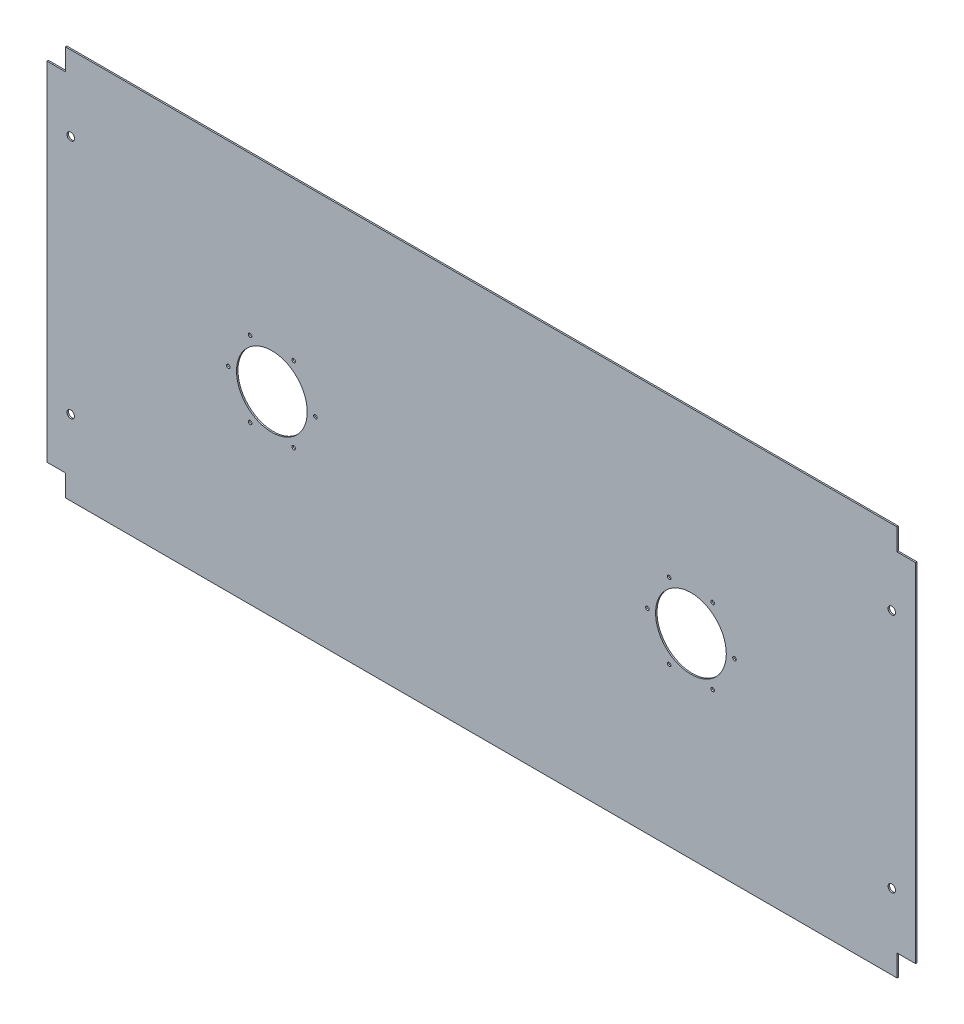
ISO-10303-21;
HEADER;
FILE_DESCRIPTION(('STEP AP214'),'2;1');
FILE_NAME('part.step','',(''),(''),'','','');
FILE_SCHEMA(('AUTOMOTIVE_DESIGN { 1 0 10303 214 1 1 1 1 }'));
ENDSEC;
DATA;
#1=APPLICATION_CONTEXT('core data for automotive mechanical design processes');
#2=APPLICATION_PROTOCOL_DEFINITION('international standard','automotive_design',2000,#1);
#3=PRODUCT_CONTEXT('',#1,'mechanical');
#4=PRODUCT('Part','Part','',(#3));
#5=PRODUCT_RELATED_PRODUCT_CATEGORY('part','',(#4));
#6=PRODUCT_DEFINITION_FORMATION('','',#4);
#7=PRODUCT_DEFINITION_CONTEXT('part definition',#1,'design');
#8=PRODUCT_DEFINITION('design','',#6,#7);
#9=PRODUCT_DEFINITION_SHAPE('','',#8);
#10=(LENGTH_UNIT() NAMED_UNIT(*) SI_UNIT(.MILLI.,.METRE.));
#11=(NAMED_UNIT(*) PLANE_ANGLE_UNIT() SI_UNIT($,.RADIAN.));
#12=(NAMED_UNIT(*) SI_UNIT($,.STERADIAN.) SOLID_ANGLE_UNIT());
#13=UNCERTAINTY_MEASURE_WITH_UNIT(LENGTH_MEASURE(1.E-05),#10,'distance_accuracy_value','');
#14=(GEOMETRIC_REPRESENTATION_CONTEXT(3) GLOBAL_UNCERTAINTY_ASSIGNED_CONTEXT((#13)) GLOBAL_UNIT_ASSIGNED_CONTEXT((#10,
#11,#12)) REPRESENTATION_CONTEXT('',''));
#15=CARTESIAN_POINT('',(0.,0.,0.));
#16=DIRECTION('',(0.,0.,1.));
#17=DIRECTION('',(1.,0.,0.));
#18=AXIS2_PLACEMENT_3D('',#15,#16,#17);
#19=CARTESIAN_POINT('',(438.9628,183.388,-100.838));
#20=DIRECTION('',(0.,-1.,0.));
#21=DIRECTION('',(0.,0.,-1.));
#22=AXIS2_PLACEMENT_3D('',#19,#20,#21);
#23=PLANE('',#22);
#24=DIRECTION('',(1.,0.,0.));
#25=VECTOR('',#24,1.);
#26=CARTESIAN_POINT('',(438.9628,183.388,0.));
#27=LINE('',#26,#25);
#28=CARTESIAN_POINT('',(438.9628,183.388,0.));
#29=VERTEX_POINT('',#28);
#30=CARTESIAN_POINT('',(458.583962531012,183.388,1.66533453693773E-13));
#31=VERTEX_POINT('',#30);
#32=EDGE_CURVE('E234',#29,#31,#27,.T.);
#33=ORIENTED_EDGE('',*,*,#32,.T.);
#34=DIRECTION('',(0.,0.,-1.));
#35=VECTOR('',#34,1.);
#36=CARTESIAN_POINT('',(458.583962531012,183.388,1.66533453693773E-13));
#37=LINE('',#36,#35);
#38=CARTESIAN_POINT('',(458.583962531012,183.388,-1.52399999999986));
#39=VERTEX_POINT('',#38);
#40=EDGE_CURVE('E265',#31,#39,#37,.T.);
#41=ORIENTED_EDGE('',*,*,#40,.T.);
#42=DIRECTION('',(1.,0.,0.));
#43=VECTOR('',#42,1.);
#44=CARTESIAN_POINT('',(0.,183.388,-1.524));
#45=LINE('',#44,#43);
#46=CARTESIAN_POINT('',(438.9628,183.388,-1.524));
#47=VERTEX_POINT('',#46);
#48=EDGE_CURVE('E151',#47,#39,#45,.T.);
#49=ORIENTED_EDGE('',*,*,#48,.F.);
#50=DIRECTION('',(0.,0.,1.));
#51=VECTOR('',#50,1.);
#52=CARTESIAN_POINT('',(438.9628,183.388,-100.838));
#53=LINE('',#52,#51);
#54=EDGE_CURVE('E328',#47,#29,#53,.T.);
#55=ORIENTED_EDGE('',*,*,#54,.T.);
#56=EDGE_LOOP('',(#33,#41,#49,#55));
#57=FACE_BOUND('',#56,.T.);
#58=ADVANCED_FACE('F135',(#57),#23,.F.);
#59=CARTESIAN_POINT('',(438.9628,189.738,-100.838));
#60=DIRECTION('',(-1.,0.,0.));
#61=DIRECTION('',(0.,0.,1.));
#62=AXIS2_PLACEMENT_3D('',#59,#60,#61);
#63=PLANE('',#62);
#64=DIRECTION('',(0.,-1.,0.));
#65=VECTOR('',#64,1.);
#66=CARTESIAN_POINT('',(438.9628,0.,-1.524));
#67=LINE('',#66,#65);
#68=CARTESIAN_POINT('',(438.9628,206.234962531012,-1.52399999999989));
#69=VERTEX_POINT('',#68);
#70=EDGE_CURVE('E243',#69,#47,#67,.T.);
#71=ORIENTED_EDGE('',*,*,#70,.F.);
#72=DIRECTION('',(0.,0.,1.));
#73=VECTOR('',#72,1.);
#74=CARTESIAN_POINT('',(438.9628,206.234962531012,1.11022302462516E-13));
#75=LINE('',#74,#73);
#76=CARTESIAN_POINT('',(438.9628,206.234962531012,0.));
#77=VERTEX_POINT('',#76);
#78=EDGE_CURVE('E240',#69,#77,#75,.T.);
#79=ORIENTED_EDGE('',*,*,#78,.T.);
#80=DIRECTION('',(0.,-1.,0.));
#81=VECTOR('',#80,1.);
#82=CARTESIAN_POINT('',(438.9628,189.738,0.));
#83=LINE('',#82,#81);
#84=EDGE_CURVE('E226',#77,#29,#83,.T.);
#85=ORIENTED_EDGE('',*,*,#84,.T.);
#86=ORIENTED_EDGE('',*,*,#54,.F.);
#87=EDGE_LOOP('',(#71,#79,#85,#86));
#88=FACE_BOUND('',#87,.T.);
#89=ADVANCED_FACE('F241',(#88),#63,.F.);
#90=CARTESIAN_POINT('',(-438.9628,183.388,-100.838));
#91=DIRECTION('',(0.,-1.,0.));
#92=DIRECTION('',(0.,0.,-1.));
#93=AXIS2_PLACEMENT_3D('',#90,#91,#92);
#94=PLANE('',#93);
#95=DIRECTION('',(1.,0.,0.));
#96=VECTOR('',#95,1.);
#97=CARTESIAN_POINT('',(0.,183.388,-1.524));
#98=LINE('',#97,#96);
#99=CARTESIAN_POINT('',(-458.583962531012,183.388,-1.52399999999986));
#100=VERTEX_POINT('',#99);
#101=CARTESIAN_POINT('',(-438.9628,183.388,-1.524));
#102=VERTEX_POINT('',#101);
#103=EDGE_CURVE('E419',#100,#102,#98,.T.);
#104=ORIENTED_EDGE('',*,*,#103,.F.);
#105=DIRECTION('',(0.,0.,1.));
#106=VECTOR('',#105,1.);
#107=CARTESIAN_POINT('',(-458.583962531012,183.388,1.66533453693773E-13));
#108=LINE('',#107,#106);
#109=CARTESIAN_POINT('',(-458.583962531012,183.388,1.11022302462516E-13));
#110=VERTEX_POINT('',#109);
#111=EDGE_CURVE('E275',#100,#110,#108,.T.);
#112=ORIENTED_EDGE('',*,*,#111,.T.);
#113=DIRECTION('',(1.,0.,0.));
#114=VECTOR('',#113,1.);
#115=CARTESIAN_POINT('',(-438.9628,183.388,0.));
#116=LINE('',#115,#114);
#117=CARTESIAN_POINT('',(-438.9628,183.388,0.));
#118=VERTEX_POINT('',#117);
#119=EDGE_CURVE('E320',#110,#118,#116,.T.);
#120=ORIENTED_EDGE('',*,*,#119,.T.);
#121=DIRECTION('',(0.,0.,1.));
#122=VECTOR('',#121,1.);
#123=CARTESIAN_POINT('',(-438.9628,183.388,-100.838));
#124=LINE('',#123,#122);
#125=EDGE_CURVE('E317',#102,#118,#124,.T.);
#126=ORIENTED_EDGE('',*,*,#125,.F.);
#127=EDGE_LOOP('',(#104,#112,#120,#126));
#128=FACE_BOUND('',#127,.T.);
#129=ADVANCED_FACE('F527',(#128),#94,.F.);
#130=CARTESIAN_POINT('',(-438.9628,189.738,-100.838));
#131=DIRECTION('',(1.,0.,0.));
#132=DIRECTION('',(0.,0.,-1.));
#133=AXIS2_PLACEMENT_3D('',#130,#131,#132);
#134=PLANE('',#133);
#135=DIRECTION('',(0.,1.,0.));
#136=VECTOR('',#135,1.);
#137=CARTESIAN_POINT('',(-438.9628,189.738,0.));
#138=LINE('',#137,#136);
#139=CARTESIAN_POINT('',(-438.9628,206.234962531012,0.));
#140=VERTEX_POINT('',#139);
#141=EDGE_CURVE('E325',#118,#140,#138,.T.);
#142=ORIENTED_EDGE('',*,*,#141,.T.);
#143=DIRECTION('',(0.,0.,-1.));
#144=VECTOR('',#143,1.);
#145=CARTESIAN_POINT('',(-438.9628,206.234962531012,1.11022302462516E-13));
#146=LINE('',#145,#144);
#147=CARTESIAN_POINT('',(-438.9628,206.234962531012,-1.52399999999989));
#148=VERTEX_POINT('',#147);
#149=EDGE_CURVE('E249',#140,#148,#146,.T.);
#150=ORIENTED_EDGE('',*,*,#149,.T.);
#151=DIRECTION('',(0.,1.,0.));
#152=VECTOR('',#151,1.);
#153=CARTESIAN_POINT('',(-438.9628,0.,-1.524));
#154=LINE('',#153,#152);
#155=EDGE_CURVE('E159',#102,#148,#154,.T.);
#156=ORIENTED_EDGE('',*,*,#155,.F.);
#157=ORIENTED_EDGE('',*,*,#125,.T.);
#158=EDGE_LOOP('',(#142,#150,#156,#157));
#159=FACE_BOUND('',#158,.T.);
#160=ADVANCED_FACE('F536',(#159),#134,.F.);
#161=CARTESIAN_POINT('',(-438.9628,-183.388,-100.838));
#162=DIRECTION('',(1.,0.,0.));
#163=DIRECTION('',(0.,0.,-1.));
#164=AXIS2_PLACEMENT_3D('',#161,#162,#163);
#165=PLANE('',#164);
#166=DIRECTION('',(0.,1.,0.));
#167=VECTOR('',#166,1.);
#168=CARTESIAN_POINT('',(-438.9628,0.,-1.524));
#169=LINE('',#168,#167);
#170=CARTESIAN_POINT('',(-438.9628,-206.234962531012,-1.52399999999991));
#171=VERTEX_POINT('',#170);
#172=CARTESIAN_POINT('',(-438.9628,-183.388,-1.524));
#173=VERTEX_POINT('',#172);
#174=EDGE_CURVE('E415',#171,#173,#169,.T.);
#175=ORIENTED_EDGE('',*,*,#174,.F.);
#176=DIRECTION('',(0.,0.,1.));
#177=VECTOR('',#176,1.);
#178=CARTESIAN_POINT('',(-438.9628,-206.234962531012,0.));
#179=LINE('',#178,#177);
#180=CARTESIAN_POINT('',(-438.9628,-206.234962531012,0.));
#181=VERTEX_POINT('',#180);
#182=EDGE_CURVE('E291',#171,#181,#179,.T.);
#183=ORIENTED_EDGE('',*,*,#182,.T.);
#184=DIRECTION('',(0.,1.,0.));
#185=VECTOR('',#184,1.);
#186=CARTESIAN_POINT('',(-438.9628,-183.388,0.));
#187=LINE('',#186,#185);
#188=CARTESIAN_POINT('',(-438.9628,-183.388,0.));
#189=VERTEX_POINT('',#188);
#190=EDGE_CURVE('E312',#181,#189,#187,.T.);
#191=ORIENTED_EDGE('',*,*,#190,.T.);
#192=DIRECTION('',(0.,0.,1.));
#193=VECTOR('',#192,1.);
#194=CARTESIAN_POINT('',(-438.9628,-183.388,-100.838));
#195=LINE('',#194,#193);
#196=EDGE_CURVE('E295',#173,#189,#195,.T.);
#197=ORIENTED_EDGE('',*,*,#196,.F.);
#198=EDGE_LOOP('',(#175,#183,#191,#197));
#199=FACE_BOUND('',#198,.T.);
#200=ADVANCED_FACE('F538',(#199),#165,.F.);
#201=CARTESIAN_POINT('',(-442.087,-183.388,-100.838));
#202=DIRECTION('',(0.,1.,0.));
#203=DIRECTION('',(0.,0.,1.));
#204=AXIS2_PLACEMENT_3D('',#201,#202,#203);
#205=PLANE('',#204);
#206=DIRECTION('',(-1.,0.,0.));
#207=VECTOR('',#206,1.);
#208=CARTESIAN_POINT('',(-442.087,-183.388,0.));
#209=LINE('',#208,#207);
#210=CARTESIAN_POINT('',(-458.583962531012,-183.388,1.11022302462516E-13));
#211=VERTEX_POINT('',#210);
#212=EDGE_CURVE('E309',#189,#211,#209,.T.);
#213=ORIENTED_EDGE('',*,*,#212,.T.);
#214=DIRECTION('',(0.,0.,-1.));
#215=VECTOR('',#214,1.);
#216=CARTESIAN_POINT('',(-458.583962531012,-183.388,1.66533453693773E-13));
#217=LINE('',#216,#215);
#218=CARTESIAN_POINT('',(-458.583962531012,-183.388,-1.52399999999986));
#219=VERTEX_POINT('',#218);
#220=EDGE_CURVE('E280',#211,#219,#217,.T.);
#221=ORIENTED_EDGE('',*,*,#220,.T.);
#222=DIRECTION('',(-1.,0.,0.));
#223=VECTOR('',#222,1.);
#224=CARTESIAN_POINT('',(0.,-183.388,-1.524));
#225=LINE('',#224,#223);
#226=EDGE_CURVE('E423',#173,#219,#225,.T.);
#227=ORIENTED_EDGE('',*,*,#226,.F.);
#228=ORIENTED_EDGE('',*,*,#196,.T.);
#229=EDGE_LOOP('',(#213,#221,#227,#228));
#230=FACE_BOUND('',#229,.T.);
#231=ADVANCED_FACE('F543',(#230),#205,.F.);
#232=CARTESIAN_POINT('',(438.9628,-183.388,-100.838));
#233=DIRECTION('',(-1.,0.,0.));
#234=DIRECTION('',(0.,0.,1.));
#235=AXIS2_PLACEMENT_3D('',#232,#233,#234);
#236=PLANE('',#235);
#237=DIRECTION('',(0.,-1.,0.));
#238=VECTOR('',#237,1.);
#239=CARTESIAN_POINT('',(438.9628,-183.388,0.));
#240=LINE('',#239,#238);
#241=CARTESIAN_POINT('',(438.9628,-183.388,0.));
#242=VERTEX_POINT('',#241);
#243=CARTESIAN_POINT('',(438.9628,-206.234962531012,0.));
#244=VERTEX_POINT('',#243);
#245=EDGE_CURVE('E321',#242,#244,#240,.T.);
#246=ORIENTED_EDGE('',*,*,#245,.T.);
#247=DIRECTION('',(0.,0.,-1.));
#248=VECTOR('',#247,1.);
#249=CARTESIAN_POINT('',(438.9628,-206.234962531012,0.));
#250=LINE('',#249,#248);
#251=CARTESIAN_POINT('',(438.9628,-206.234962531012,-1.52399999999991));
#252=VERTEX_POINT('',#251);
#253=EDGE_CURVE('E296',#244,#252,#250,.T.);
#254=ORIENTED_EDGE('',*,*,#253,.T.);
#255=DIRECTION('',(0.,-1.,0.));
#256=VECTOR('',#255,1.);
#257=CARTESIAN_POINT('',(438.9628,0.,-1.524));
#258=LINE('',#257,#256);
#259=CARTESIAN_POINT('',(438.9628,-183.388,-1.524));
#260=VERTEX_POINT('',#259);
#261=EDGE_CURVE('E412',#260,#252,#258,.T.);
#262=ORIENTED_EDGE('',*,*,#261,.F.);
#263=DIRECTION('',(0.,0.,1.));
#264=VECTOR('',#263,1.);
#265=CARTESIAN_POINT('',(438.9628,-183.388,-100.838));
#266=LINE('',#265,#264);
#267=EDGE_CURVE('E316',#260,#242,#266,.T.);
#268=ORIENTED_EDGE('',*,*,#267,.T.);
#269=EDGE_LOOP('',(#246,#254,#262,#268));
#270=FACE_BOUND('',#269,.T.);
#271=ADVANCED_FACE('F534',(#270),#236,.F.);
#272=CARTESIAN_POINT('',(438.9628,-183.388,-100.838));
#273=DIRECTION('',(0.,1.,0.));
#274=DIRECTION('',(0.,0.,1.));
#275=AXIS2_PLACEMENT_3D('',#272,#273,#274);
#276=PLANE('',#275);
#277=DIRECTION('',(-1.,0.,0.));
#278=VECTOR('',#277,1.);
#279=CARTESIAN_POINT('',(0.,-183.388,-1.524));
#280=LINE('',#279,#278);
#281=CARTESIAN_POINT('',(458.583962531012,-183.388,-1.52399999999986));
#282=VERTEX_POINT('',#281);
#283=EDGE_CURVE('E426',#282,#260,#280,.T.);
#284=ORIENTED_EDGE('',*,*,#283,.F.);
#285=DIRECTION('',(0.,0.,1.));
#286=VECTOR('',#285,1.);
#287=CARTESIAN_POINT('',(458.583962531012,-183.388,1.66533453693773E-13));
#288=LINE('',#287,#286);
#289=CARTESIAN_POINT('',(458.583962531012,-183.388,1.11022302462516E-13));
#290=VERTEX_POINT('',#289);
#291=EDGE_CURVE('E260',#282,#290,#288,.T.);
#292=ORIENTED_EDGE('',*,*,#291,.T.);
#293=DIRECTION('',(-1.,0.,0.));
#294=VECTOR('',#293,1.);
#295=CARTESIAN_POINT('',(438.9628,-183.388,0.));
#296=LINE('',#295,#294);
#297=EDGE_CURVE('E332',#290,#242,#296,.T.);
#298=ORIENTED_EDGE('',*,*,#297,.T.);
#299=ORIENTED_EDGE('',*,*,#267,.F.);
#300=EDGE_LOOP('',(#284,#292,#298,#299));
#301=FACE_BOUND('',#300,.T.);
#302=ADVANCED_FACE('F531',(#301),#276,.F.);
#303=CARTESIAN_POINT('',(0.,0.,-1.524));
#304=DIRECTION('',(0.,0.,1.));
#305=DIRECTION('',(1.,0.,0.));
#306=AXIS2_PLACEMENT_3D('',#303,#304,#305);
#307=PLANE('',#306);
#308=CARTESIAN_POINT('',(267.335,0.,-1.524));
#309=DIRECTION('',(0.,0.,1.));
#310=DIRECTION('',(1.,0.,0.));
#311=AXIS2_PLACEMENT_3D('',#308,#309,#310);
#312=CIRCLE('',#311,1.90499999999999);
#313=CARTESIAN_POINT('',(269.24,0.,-1.524));
#314=VERTEX_POINT('',#313);
#315=EDGE_CURVE('E13',#314,#314,#312,.T.);
#316=ORIENTED_EDGE('',*,*,#315,.T.);
#317=EDGE_LOOP('',(#316));
#318=FACE_BOUND('',#317,.T.);
#319=CARTESIAN_POINT('',(244.348,39.814651913586,-1.524));
#320=DIRECTION('',(0.,0.,1.));
#321=DIRECTION('',(1.,0.,0.));
#322=AXIS2_PLACEMENT_3D('',#319,#320,#321);
#323=CIRCLE('',#322,1.90499999999999);
#324=CARTESIAN_POINT('',(246.253,39.814651913586,-1.524));
#325=VERTEX_POINT('',#324);
#326=EDGE_CURVE('E144',#325,#325,#323,.T.);
#327=ORIENTED_EDGE('',*,*,#326,.T.);
#328=EDGE_LOOP('',(#327));
#329=FACE_BOUND('',#328,.T.);
#330=CARTESIAN_POINT('',(198.374,-39.814651913586,-1.524));
#331=DIRECTION('',(0.,0.,1.));
#332=DIRECTION('',(1.,0.,0.));
#333=AXIS2_PLACEMENT_3D('',#330,#331,#332);
#334=CIRCLE('',#333,1.90499999999999);
#335=CARTESIAN_POINT('',(200.279,-39.814651913586,-1.524));
#336=VERTEX_POINT('',#335);
#337=EDGE_CURVE('E496',#336,#336,#334,.T.);
#338=ORIENTED_EDGE('',*,*,#337,.T.);
#339=EDGE_LOOP('',(#338));
#340=FACE_BOUND('',#339,.T.);
#341=CARTESIAN_POINT('',(244.348,-39.8146519135856,-1.524));
#342=DIRECTION('',(0.,0.,1.));
#343=DIRECTION('',(1.,0.,0.));
#344=AXIS2_PLACEMENT_3D('',#341,#342,#343);
#345=CIRCLE('',#344,1.90499999999999);
#346=CARTESIAN_POINT('',(246.253,-39.8146519135856,-1.524));
#347=VERTEX_POINT('',#346);
#348=EDGE_CURVE('E492',#347,#347,#345,.T.);
#349=ORIENTED_EDGE('',*,*,#348,.T.);
#350=EDGE_LOOP('',(#349));
#351=FACE_BOUND('',#350,.T.);
#352=CARTESIAN_POINT('',(-433.451,-127.,-1.524));
#353=DIRECTION('',(0.,0.,1.));
#354=DIRECTION('',(1.,0.,0.));
#355=AXIS2_PLACEMENT_3D('',#352,#353,#354);
#356=CIRCLE('',#355,3.9624);
#357=CARTESIAN_POINT('',(-429.4886,-127.,-1.524));
#358=VERTEX_POINT('',#357);
#359=EDGE_CURVE('E488',#358,#358,#356,.T.);
#360=ORIENTED_EDGE('',*,*,#359,.T.);
#361=EDGE_LOOP('',(#360));
#362=FACE_BOUND('',#361,.T.);
#363=CARTESIAN_POINT('',(433.451,127.,-1.524));
#364=DIRECTION('',(0.,0.,1.));
#365=DIRECTION('',(1.,0.,0.));
#366=AXIS2_PLACEMENT_3D('',#363,#364,#365);
#367=CIRCLE('',#366,3.9624);
#368=CARTESIAN_POINT('',(437.4134,127.,-1.524));
#369=VERTEX_POINT('',#368);
#370=EDGE_CURVE('E484',#369,#369,#367,.T.);
#371=ORIENTED_EDGE('',*,*,#370,.T.);
#372=EDGE_LOOP('',(#371));
#373=FACE_BOUND('',#372,.T.);
#374=CARTESIAN_POINT('',(433.451,-127.,-1.524));
#375=DIRECTION('',(0.,0.,1.));
#376=DIRECTION('',(1.,0.,0.));
#377=AXIS2_PLACEMENT_3D('',#374,#375,#376);
#378=CIRCLE('',#377,3.9624);
#379=CARTESIAN_POINT('',(437.4134,-127.,-1.524));
#380=VERTEX_POINT('',#379);
#381=EDGE_CURVE('E480',#380,#380,#378,.T.);
#382=ORIENTED_EDGE('',*,*,#381,.T.);
#383=EDGE_LOOP('',(#382));
#384=FACE_BOUND('',#383,.T.);
#385=CARTESIAN_POINT('',(198.374,39.8146519135857,-1.524));
#386=DIRECTION('',(0.,0.,1.));
#387=DIRECTION('',(1.,0.,0.));
#388=AXIS2_PLACEMENT_3D('',#385,#386,#387);
#389=CIRCLE('',#388,1.90499999999999);
#390=CARTESIAN_POINT('',(200.279,39.8146519135857,-1.524));
#391=VERTEX_POINT('',#390);
#392=EDGE_CURVE('E476',#391,#391,#389,.T.);
#393=ORIENTED_EDGE('',*,*,#392,.T.);
#394=EDGE_LOOP('',(#393));
#395=FACE_BOUND('',#394,.T.);
#396=CARTESIAN_POINT('',(-198.12,39.814651913586,-1.524));
#397=DIRECTION('',(0.,0.,1.));
#398=DIRECTION('',(1.,0.,0.));
#399=AXIS2_PLACEMENT_3D('',#396,#397,#398);
#400=CIRCLE('',#399,1.90499999999999);
#401=CARTESIAN_POINT('',(-196.215,39.814651913586,-1.524));
#402=VERTEX_POINT('',#401);
#403=EDGE_CURVE('E472',#402,#402,#400,.T.);
#404=ORIENTED_EDGE('',*,*,#403,.T.);
#405=EDGE_LOOP('',(#404));
#406=FACE_BOUND('',#405,.T.);
#407=CARTESIAN_POINT('',(-175.133,0.,-1.524));
#408=DIRECTION('',(0.,0.,1.));
#409=DIRECTION('',(1.,0.,0.));
#410=AXIS2_PLACEMENT_3D('',#407,#408,#409);
#411=CIRCLE('',#410,1.90499999999999);
#412=CARTESIAN_POINT('',(-173.228,0.,-1.524));
#413=VERTEX_POINT('',#412);
#414=EDGE_CURVE('E468',#413,#413,#411,.T.);
#415=ORIENTED_EDGE('',*,*,#414,.T.);
#416=EDGE_LOOP('',(#415));
#417=FACE_BOUND('',#416,.T.);
#418=CARTESIAN_POINT('',(-267.081,0.,-1.524));
#419=DIRECTION('',(0.,0.,1.));
#420=DIRECTION('',(1.,0.,0.));
#421=AXIS2_PLACEMENT_3D('',#418,#419,#420);
#422=CIRCLE('',#421,1.90499999999999);
#423=CARTESIAN_POINT('',(-265.176,0.,-1.524));
#424=VERTEX_POINT('',#423);
#425=EDGE_CURVE('E464',#424,#424,#422,.T.);
#426=ORIENTED_EDGE('',*,*,#425,.T.);
#427=EDGE_LOOP('',(#426));
#428=FACE_BOUND('',#427,.T.);
#429=CARTESIAN_POINT('',(221.361,0.,-1.524));
#430=DIRECTION('',(0.,0.,1.));
#431=DIRECTION('',(1.,0.,0.));
#432=AXIS2_PLACEMENT_3D('',#429,#430,#431);
#433=CIRCLE('',#432,37.338);
#434=CARTESIAN_POINT('',(258.699,0.,-1.524));
#435=VERTEX_POINT('',#434);
#436=EDGE_CURVE('E460',#435,#435,#433,.T.);
#437=ORIENTED_EDGE('',*,*,#436,.T.);
#438=EDGE_LOOP('',(#437));
#439=FACE_BOUND('',#438,.T.);
#440=CARTESIAN_POINT('',(-244.094,39.8146519135857,-1.524));
#441=DIRECTION('',(0.,0.,1.));
#442=DIRECTION('',(1.,0.,0.));
#443=AXIS2_PLACEMENT_3D('',#440,#441,#442);
#444=CIRCLE('',#443,1.90499999999999);
#445=CARTESIAN_POINT('',(-242.189,39.8146519135857,-1.524));
#446=VERTEX_POINT('',#445);
#447=EDGE_CURVE('E456',#446,#446,#444,.T.);
#448=ORIENTED_EDGE('',*,*,#447,.T.);
#449=EDGE_LOOP('',(#448));
#450=FACE_BOUND('',#449,.T.);
#451=CARTESIAN_POINT('',(-244.094,-39.814651913586,-1.524));
#452=DIRECTION('',(0.,0.,1.));
#453=DIRECTION('',(1.,0.,0.));
#454=AXIS2_PLACEMENT_3D('',#451,#452,#453);
#455=CIRCLE('',#454,1.90499999999999);
#456=CARTESIAN_POINT('',(-242.189,-39.814651913586,-1.524));
#457=VERTEX_POINT('',#456);
#458=EDGE_CURVE('E452',#457,#457,#455,.T.);
#459=ORIENTED_EDGE('',*,*,#458,.T.);
#460=EDGE_LOOP('',(#459));
#461=FACE_BOUND('',#460,.T.);
#462=CARTESIAN_POINT('',(-198.12,-39.8146519135857,-1.524));
#463=DIRECTION('',(0.,0.,1.));
#464=DIRECTION('',(1.,0.,0.));
#465=AXIS2_PLACEMENT_3D('',#462,#463,#464);
#466=CIRCLE('',#465,1.90499999999999);
#467=CARTESIAN_POINT('',(-196.215,-39.8146519135857,-1.524));
#468=VERTEX_POINT('',#467);
#469=EDGE_CURVE('E448',#468,#468,#466,.T.);
#470=ORIENTED_EDGE('',*,*,#469,.T.);
#471=EDGE_LOOP('',(#470));
#472=FACE_BOUND('',#471,.T.);
#473=CARTESIAN_POINT('',(175.387,0.,-1.524));
#474=DIRECTION('',(0.,0.,1.));
#475=DIRECTION('',(1.,0.,0.));
#476=AXIS2_PLACEMENT_3D('',#473,#474,#475);
#477=CIRCLE('',#476,1.90499999999999);
#478=CARTESIAN_POINT('',(177.292,0.,-1.524));
#479=VERTEX_POINT('',#478);
#480=EDGE_CURVE('E444',#479,#479,#477,.T.);
#481=ORIENTED_EDGE('',*,*,#480,.T.);
#482=EDGE_LOOP('',(#481));
#483=FACE_BOUND('',#482,.T.);
#484=CARTESIAN_POINT('',(-433.451,127.,-1.524));
#485=DIRECTION('',(0.,0.,1.));
#486=DIRECTION('',(1.,0.,0.));
#487=AXIS2_PLACEMENT_3D('',#484,#485,#486);
#488=CIRCLE('',#487,3.9624);
#489=CARTESIAN_POINT('',(-429.4886,127.,-1.524));
#490=VERTEX_POINT('',#489);
#491=EDGE_CURVE('E440',#490,#490,#488,.T.);
#492=ORIENTED_EDGE('',*,*,#491,.T.);
#493=EDGE_LOOP('',(#492));
#494=FACE_BOUND('',#493,.T.);
#495=CARTESIAN_POINT('',(-221.107,0.,-1.524));
#496=DIRECTION('',(0.,0.,1.));
#497=DIRECTION('',(1.,0.,0.));
#498=AXIS2_PLACEMENT_3D('',#495,#496,#497);
#499=CIRCLE('',#498,37.338);
#500=CARTESIAN_POINT('',(-183.769,0.,-1.524));
#501=VERTEX_POINT('',#500);
#502=EDGE_CURVE('E436',#501,#501,#499,.T.);
#503=ORIENTED_EDGE('',*,*,#502,.T.);
#504=EDGE_LOOP('',(#503));
#505=FACE_BOUND('',#504,.T.);
#506=ORIENTED_EDGE('',*,*,#174,.T.);
#507=ORIENTED_EDGE('',*,*,#226,.T.);
#508=DIRECTION('',(0.,1.,0.));
#509=VECTOR('',#508,1.);
#510=CARTESIAN_POINT('',(-458.583962531012,0.,-1.52399999999986));
#511=LINE('',#510,#509);
#512=EDGE_CURVE('E284',#219,#100,#511,.T.);
#513=ORIENTED_EDGE('',*,*,#512,.T.);
#514=ORIENTED_EDGE('',*,*,#103,.T.);
#515=ORIENTED_EDGE('',*,*,#155,.T.);
#516=DIRECTION('',(-1.,0.,0.));
#517=VECTOR('',#516,1.);
#518=CARTESIAN_POINT('',(0.,206.234962531012,-1.52399999999989));
#519=LINE('',#518,#517);
#520=EDGE_CURVE('E254',#148,#69,#519,.F.);
#521=ORIENTED_EDGE('',*,*,#520,.T.);
#522=ORIENTED_EDGE('',*,*,#70,.T.);
#523=ORIENTED_EDGE('',*,*,#48,.T.);
#524=DIRECTION('',(0.,-1.,0.));
#525=VECTOR('',#524,1.);
#526=CARTESIAN_POINT('',(458.583962531012,0.,-1.52399999999986));
#527=LINE('',#526,#525);
#528=EDGE_CURVE('E268',#39,#282,#527,.T.);
#529=ORIENTED_EDGE('',*,*,#528,.T.);
#530=ORIENTED_EDGE('',*,*,#283,.T.);
#531=ORIENTED_EDGE('',*,*,#261,.T.);
#532=DIRECTION('',(-1.,0.,0.));
#533=VECTOR('',#532,1.);
#534=CARTESIAN_POINT('',(0.,-206.234962531012,-1.52399999999991));
#535=LINE('',#534,#533);
#536=EDGE_CURVE('E300',#252,#171,#535,.T.);
#537=ORIENTED_EDGE('',*,*,#536,.T.);
#538=EDGE_LOOP('',(#506,#507,#513,#514,#515,#521,#522,#523,#529,#530,#531,#537));
#539=FACE_BOUND('',#538,.T.);
#540=ADVANCED_FACE('F503',(#318,#329,#340,#351,#362,#373,#384,#395,#406,#417,#428,#439,#450,
#461,#472,#483,#494,#505,#539),#307,.F.);
#541=CARTESIAN_POINT('',(0.,0.,0.));
#542=DIRECTION('',(0.,0.,1.));
#543=DIRECTION('',(1.,0.,0.));
#544=AXIS2_PLACEMENT_3D('',#541,#542,#543);
#545=PLANE('',#544);
#546=CARTESIAN_POINT('',(267.335,0.,0.));
#547=DIRECTION('',(0.,0.,1.));
#548=DIRECTION('',(1.,0.,0.));
#549=AXIS2_PLACEMENT_3D('',#546,#547,#548);
#550=CIRCLE('',#549,1.90499999999999);
#551=CARTESIAN_POINT('',(269.24,0.,0.));
#552=VERTEX_POINT('',#551);
#553=EDGE_CURVE('E361',#552,#552,#550,.T.);
#554=ORIENTED_EDGE('',*,*,#553,.F.);
#555=EDGE_LOOP('',(#554));
#556=FACE_BOUND('',#555,.T.);
#557=CARTESIAN_POINT('',(244.348,39.814651913586,0.));
#558=DIRECTION('',(0.,0.,1.));
#559=DIRECTION('',(1.,0.,0.));
#560=AXIS2_PLACEMENT_3D('',#557,#558,#559);
#561=CIRCLE('',#560,1.90499999999999);
#562=CARTESIAN_POINT('',(246.253,39.814651913586,0.));
#563=VERTEX_POINT('',#562);
#564=EDGE_CURVE('E366',#563,#563,#561,.T.);
#565=ORIENTED_EDGE('',*,*,#564,.F.);
#566=EDGE_LOOP('',(#565));
#567=FACE_BOUND('',#566,.T.);
#568=CARTESIAN_POINT('',(198.374,-39.814651913586,0.));
#569=DIRECTION('',(0.,0.,1.));
#570=DIRECTION('',(1.,0.,0.));
#571=AXIS2_PLACEMENT_3D('',#568,#569,#570);
#572=CIRCLE('',#571,1.90499999999999);
#573=CARTESIAN_POINT('',(200.279,-39.814651913586,0.));
#574=VERTEX_POINT('',#573);
#575=EDGE_CURVE('E370',#574,#574,#572,.T.);
#576=ORIENTED_EDGE('',*,*,#575,.F.);
#577=EDGE_LOOP('',(#576));
#578=FACE_BOUND('',#577,.T.);
#579=CARTESIAN_POINT('',(244.348,-39.8146519135856,0.));
#580=DIRECTION('',(0.,0.,1.));
#581=DIRECTION('',(1.,0.,0.));
#582=AXIS2_PLACEMENT_3D('',#579,#580,#581);
#583=CIRCLE('',#582,1.90499999999999);
#584=CARTESIAN_POINT('',(246.253,-39.8146519135856,0.));
#585=VERTEX_POINT('',#584);
#586=EDGE_CURVE('E357',#585,#585,#583,.T.);
#587=ORIENTED_EDGE('',*,*,#586,.F.);
#588=EDGE_LOOP('',(#587));
#589=FACE_BOUND('',#588,.T.);
#590=CARTESIAN_POINT('',(-433.451,-127.,0.));
#591=DIRECTION('',(0.,0.,1.));
#592=DIRECTION('',(1.,0.,0.));
#593=AXIS2_PLACEMENT_3D('',#590,#591,#592);
#594=CIRCLE('',#593,3.9624);
#595=CARTESIAN_POINT('',(-429.4886,-127.,0.));
#596=VERTEX_POINT('',#595);
#597=EDGE_CURVE('E340',#596,#596,#594,.T.);
#598=ORIENTED_EDGE('',*,*,#597,.F.);
#599=EDGE_LOOP('',(#598));
#600=FACE_BOUND('',#599,.T.);
#601=CARTESIAN_POINT('',(433.451,127.,0.));
#602=DIRECTION('',(0.,0.,1.));
#603=DIRECTION('',(1.,0.,0.));
#604=AXIS2_PLACEMENT_3D('',#601,#602,#603);
#605=CIRCLE('',#604,3.9624);
#606=CARTESIAN_POINT('',(437.4134,127.,0.));
#607=VERTEX_POINT('',#606);
#608=EDGE_CURVE('E345',#607,#607,#605,.T.);
#609=ORIENTED_EDGE('',*,*,#608,.F.);
#610=EDGE_LOOP('',(#609));
#611=FACE_BOUND('',#610,.T.);
#612=CARTESIAN_POINT('',(433.451,-127.,0.));
#613=DIRECTION('',(0.,0.,1.));
#614=DIRECTION('',(1.,0.,0.));
#615=AXIS2_PLACEMENT_3D('',#612,#613,#614);
#616=CIRCLE('',#615,3.9624);
#617=CARTESIAN_POINT('',(437.4134,-127.,0.));
#618=VERTEX_POINT('',#617);
#619=EDGE_CURVE('E349',#618,#618,#616,.T.);
#620=ORIENTED_EDGE('',*,*,#619,.F.);
#621=EDGE_LOOP('',(#620));
#622=FACE_BOUND('',#621,.T.);
#623=CARTESIAN_POINT('',(198.374,39.8146519135857,0.));
#624=DIRECTION('',(0.,0.,1.));
#625=DIRECTION('',(1.,0.,0.));
#626=AXIS2_PLACEMENT_3D('',#623,#624,#625);
#627=CIRCLE('',#626,1.90499999999999);
#628=CARTESIAN_POINT('',(200.279,39.8146519135857,0.));
#629=VERTEX_POINT('',#628);
#630=EDGE_CURVE('E353',#629,#629,#627,.T.);
#631=ORIENTED_EDGE('',*,*,#630,.F.);
#632=EDGE_LOOP('',(#631));
#633=FACE_BOUND('',#632,.T.);
#634=CARTESIAN_POINT('',(-198.12,39.814651913586,0.));
#635=DIRECTION('',(0.,0.,1.));
#636=DIRECTION('',(1.,0.,0.));
#637=AXIS2_PLACEMENT_3D('',#634,#635,#636);
#638=CIRCLE('',#637,1.90499999999999);
#639=CARTESIAN_POINT('',(-196.215,39.814651913586,0.));
#640=VERTEX_POINT('',#639);
#641=EDGE_CURVE('E381',#640,#640,#638,.T.);
#642=ORIENTED_EDGE('',*,*,#641,.F.);
#643=EDGE_LOOP('',(#642));
#644=FACE_BOUND('',#643,.T.);
#645=CARTESIAN_POINT('',(-175.133,0.,0.));
#646=DIRECTION('',(0.,0.,1.));
#647=DIRECTION('',(1.,0.,0.));
#648=AXIS2_PLACEMENT_3D('',#645,#646,#647);
#649=CIRCLE('',#648,1.90499999999999);
#650=CARTESIAN_POINT('',(-173.228,0.,0.));
#651=VERTEX_POINT('',#650);
#652=EDGE_CURVE('E393',#651,#651,#649,.T.);
#653=ORIENTED_EDGE('',*,*,#652,.F.);
#654=EDGE_LOOP('',(#653));
#655=FACE_BOUND('',#654,.T.);
#656=CARTESIAN_POINT('',(-267.081,0.,0.));
#657=DIRECTION('',(0.,0.,1.));
#658=DIRECTION('',(1.,0.,0.));
#659=AXIS2_PLACEMENT_3D('',#656,#657,#658);
#660=CIRCLE('',#659,1.90499999999999);
#661=CARTESIAN_POINT('',(-265.176,0.,0.));
#662=VERTEX_POINT('',#661);
#663=EDGE_CURVE('E397',#662,#662,#660,.T.);
#664=ORIENTED_EDGE('',*,*,#663,.F.);
#665=EDGE_LOOP('',(#664));
#666=FACE_BOUND('',#665,.T.);
#667=CARTESIAN_POINT('',(221.361,0.,0.));
#668=DIRECTION('',(0.,0.,1.));
#669=DIRECTION('',(1.,0.,0.));
#670=AXIS2_PLACEMENT_3D('',#667,#668,#669);
#671=CIRCLE('',#670,37.338);
#672=CARTESIAN_POINT('',(258.699,0.,0.));
#673=VERTEX_POINT('',#672);
#674=EDGE_CURVE('E401',#673,#673,#671,.T.);
#675=ORIENTED_EDGE('',*,*,#674,.F.);
#676=EDGE_LOOP('',(#675));
#677=FACE_BOUND('',#676,.T.);
#678=CARTESIAN_POINT('',(-244.094,39.8146519135857,0.));
#679=DIRECTION('',(0.,0.,1.));
#680=DIRECTION('',(1.,0.,0.));
#681=AXIS2_PLACEMENT_3D('',#678,#679,#680);
#682=CIRCLE('',#681,1.90499999999999);
#683=CARTESIAN_POINT('',(-242.189,39.8146519135857,0.));
#684=VERTEX_POINT('',#683);
#685=EDGE_CURVE('E377',#684,#684,#682,.T.);
#686=ORIENTED_EDGE('',*,*,#685,.F.);
#687=EDGE_LOOP('',(#686));
#688=FACE_BOUND('',#687,.T.);
#689=CARTESIAN_POINT('',(-244.094,-39.814651913586,0.));
#690=DIRECTION('',(0.,0.,1.));
#691=DIRECTION('',(1.,0.,0.));
#692=AXIS2_PLACEMENT_3D('',#689,#690,#691);
#693=CIRCLE('',#692,1.90499999999999);
#694=CARTESIAN_POINT('',(-242.189,-39.814651913586,0.));
#695=VERTEX_POINT('',#694);
#696=EDGE_CURVE('E382',#695,#695,#693,.T.);
#697=ORIENTED_EDGE('',*,*,#696,.F.);
#698=EDGE_LOOP('',(#697));
#699=FACE_BOUND('',#698,.T.);
#700=CARTESIAN_POINT('',(-198.12,-39.8146519135857,0.));
#701=DIRECTION('',(0.,0.,1.));
#702=DIRECTION('',(1.,0.,0.));
#703=AXIS2_PLACEMENT_3D('',#700,#701,#702);
#704=CIRCLE('',#703,1.90499999999999);
#705=CARTESIAN_POINT('',(-196.215,-39.8146519135857,0.));
#706=VERTEX_POINT('',#705);
#707=EDGE_CURVE('E386',#706,#706,#704,.T.);
#708=ORIENTED_EDGE('',*,*,#707,.F.);
#709=EDGE_LOOP('',(#708));
#710=FACE_BOUND('',#709,.T.);
#711=CARTESIAN_POINT('',(175.387,0.,0.));
#712=DIRECTION('',(0.,0.,1.));
#713=DIRECTION('',(1.,0.,0.));
#714=AXIS2_PLACEMENT_3D('',#711,#712,#713);
#715=CIRCLE('',#714,1.90499999999999);
#716=CARTESIAN_POINT('',(177.292,0.,0.));
#717=VERTEX_POINT('',#716);
#718=EDGE_CURVE('E365',#717,#717,#715,.T.);
#719=ORIENTED_EDGE('',*,*,#718,.F.);
#720=EDGE_LOOP('',(#719));
#721=FACE_BOUND('',#720,.T.);
#722=ORIENTED_EDGE('',*,*,#212,.F.);
#723=ORIENTED_EDGE('',*,*,#190,.F.);
#724=DIRECTION('',(1.,0.,0.));
#725=VECTOR('',#724,1.);
#726=CARTESIAN_POINT('',(442.087,-206.234962531012,0.));
#727=LINE('',#726,#725);
#728=EDGE_CURVE('E279',#244,#181,#727,.F.);
#729=ORIENTED_EDGE('',*,*,#728,.F.);
#730=ORIENTED_EDGE('',*,*,#245,.F.);
#731=ORIENTED_EDGE('',*,*,#297,.F.);
#732=DIRECTION('',(0.,1.,0.));
#733=VECTOR('',#732,1.);
#734=CARTESIAN_POINT('',(458.583962531012,189.738,1.66533453693773E-13));
#735=LINE('',#734,#733);
#736=EDGE_CURVE('E248',#31,#290,#735,.F.);
#737=ORIENTED_EDGE('',*,*,#736,.F.);
#738=ORIENTED_EDGE('',*,*,#32,.F.);
#739=ORIENTED_EDGE('',*,*,#84,.F.);
#740=DIRECTION('',(1.,0.,0.));
#741=VECTOR('',#740,1.);
#742=CARTESIAN_POINT('',(442.087,206.234962531012,1.11022302462516E-13));
#743=LINE('',#742,#741);
#744=EDGE_CURVE('E232',#140,#77,#743,.T.);
#745=ORIENTED_EDGE('',*,*,#744,.F.);
#746=ORIENTED_EDGE('',*,*,#141,.F.);
#747=ORIENTED_EDGE('',*,*,#119,.F.);
#748=DIRECTION('',(0.,-1.,0.));
#749=VECTOR('',#748,1.);
#750=CARTESIAN_POINT('',(-458.583962531012,-189.738,1.66533453693773E-13));
#751=LINE('',#750,#749);
#752=EDGE_CURVE('E264',#211,#110,#751,.F.);
#753=ORIENTED_EDGE('',*,*,#752,.F.);
#754=EDGE_LOOP('',(#722,#723,#729,#730,#731,#737,#738,#739,#745,#746,#747,#753));
#755=FACE_BOUND('',#754,.T.);
#756=CARTESIAN_POINT('',(-433.451,127.,0.));
#757=DIRECTION('',(0.,0.,1.));
#758=DIRECTION('',(1.,0.,0.));
#759=AXIS2_PLACEMENT_3D('',#756,#757,#758);
#760=CIRCLE('',#759,3.9624);
#761=CARTESIAN_POINT('',(-429.4886,127.,0.));
#762=VERTEX_POINT('',#761);
#763=EDGE_CURVE('E237',#762,#762,#760,.T.);
#764=ORIENTED_EDGE('',*,*,#763,.F.);
#765=EDGE_LOOP('',(#764));
#766=FACE_BOUND('',#765,.T.);
#767=CARTESIAN_POINT('',(-221.107,0.,0.));
#768=DIRECTION('',(0.,0.,1.));
#769=DIRECTION('',(1.,0.,0.));
#770=AXIS2_PLACEMENT_3D('',#767,#768,#769);
#771=CIRCLE('',#770,37.338);
#772=CARTESIAN_POINT('',(-183.769,0.,0.));
#773=VERTEX_POINT('',#772);
#774=EDGE_CURVE('E405',#773,#773,#771,.T.);
#775=ORIENTED_EDGE('',*,*,#774,.F.);
#776=EDGE_LOOP('',(#775));
#777=FACE_BOUND('',#776,.T.);
#778=ADVANCED_FACE('F137',(#556,#567,#578,#589,#600,#611,#622,#633,#644,#655,#666,#677,#688,
#699,#710,#721,#755,#766,#777),#545,.T.);
#779=CARTESIAN_POINT('',(-221.107,0.,-100.838));
#780=DIRECTION('',(0.,0.,1.));
#781=DIRECTION('',(1.,0.,0.));
#782=AXIS2_PLACEMENT_3D('',#779,#780,#781);
#783=CYLINDRICAL_SURFACE('',#782,37.338);
#784=ORIENTED_EDGE('',*,*,#774,.T.);
#785=EDGE_LOOP('',(#784));
#786=FACE_BOUND('',#785,.T.);
#787=ORIENTED_EDGE('',*,*,#502,.F.);
#788=EDGE_LOOP('',(#787));
#789=FACE_BOUND('',#788,.T.);
#790=ADVANCED_FACE('F575',(#786,#789),#783,.F.);
#791=CARTESIAN_POINT('',(-433.451,127.,-100.838));
#792=DIRECTION('',(0.,0.,1.));
#793=DIRECTION('',(1.,0.,0.));
#794=AXIS2_PLACEMENT_3D('',#791,#792,#793);
#795=CYLINDRICAL_SURFACE('',#794,3.9624);
#796=ORIENTED_EDGE('',*,*,#763,.T.);
#797=EDGE_LOOP('',(#796));
#798=FACE_BOUND('',#797,.T.);
#799=ORIENTED_EDGE('',*,*,#491,.F.);
#800=EDGE_LOOP('',(#799));
#801=FACE_BOUND('',#800,.T.);
#802=ADVANCED_FACE('F741',(#798,#801),#795,.F.);
#803=CARTESIAN_POINT('',(175.387,0.,-100.838));
#804=DIRECTION('',(0.,0.,1.));
#805=DIRECTION('',(1.,0.,0.));
#806=AXIS2_PLACEMENT_3D('',#803,#804,#805);
#807=CYLINDRICAL_SURFACE('',#806,1.90499999999999);
#808=ORIENTED_EDGE('',*,*,#718,.T.);
#809=EDGE_LOOP('',(#808));
#810=FACE_BOUND('',#809,.T.);
#811=ORIENTED_EDGE('',*,*,#480,.F.);
#812=EDGE_LOOP('',(#811));
#813=FACE_BOUND('',#812,.T.);
#814=ADVANCED_FACE('F751',(#810,#813),#807,.F.);
#815=CARTESIAN_POINT('',(-198.12,-39.8146519135857,-100.838));
#816=DIRECTION('',(0.,0.,1.));
#817=DIRECTION('',(1.,0.,0.));
#818=AXIS2_PLACEMENT_3D('',#815,#816,#817);
#819=CYLINDRICAL_SURFACE('',#818,1.90499999999999);
#820=ORIENTED_EDGE('',*,*,#707,.T.);
#821=EDGE_LOOP('',(#820));
#822=FACE_BOUND('',#821,.T.);
#823=ORIENTED_EDGE('',*,*,#469,.F.);
#824=EDGE_LOOP('',(#823));
#825=FACE_BOUND('',#824,.T.);
#826=ADVANCED_FACE('F762',(#822,#825),#819,.F.);
#827=CARTESIAN_POINT('',(-244.094,-39.814651913586,-100.838));
#828=DIRECTION('',(0.,0.,1.));
#829=DIRECTION('',(1.,0.,0.));
#830=AXIS2_PLACEMENT_3D('',#827,#828,#829);
#831=CYLINDRICAL_SURFACE('',#830,1.90499999999999);
#832=ORIENTED_EDGE('',*,*,#696,.T.);
#833=EDGE_LOOP('',(#832));
#834=FACE_BOUND('',#833,.T.);
#835=ORIENTED_EDGE('',*,*,#458,.F.);
#836=EDGE_LOOP('',(#835));
#837=FACE_BOUND('',#836,.T.);
#838=ADVANCED_FACE('F773',(#834,#837),#831,.F.);
#839=CARTESIAN_POINT('',(-244.094,39.8146519135857,-100.838));
#840=DIRECTION('',(0.,0.,1.));
#841=DIRECTION('',(1.,0.,0.));
#842=AXIS2_PLACEMENT_3D('',#839,#840,#841);
#843=CYLINDRICAL_SURFACE('',#842,1.90499999999999);
#844=ORIENTED_EDGE('',*,*,#685,.T.);
#845=EDGE_LOOP('',(#844));
#846=FACE_BOUND('',#845,.T.);
#847=ORIENTED_EDGE('',*,*,#447,.F.);
#848=EDGE_LOOP('',(#847));
#849=FACE_BOUND('',#848,.T.);
#850=ADVANCED_FACE('F784',(#846,#849),#843,.F.);
#851=CARTESIAN_POINT('',(221.361,0.,-100.838));
#852=DIRECTION('',(0.,0.,1.));
#853=DIRECTION('',(1.,0.,0.));
#854=AXIS2_PLACEMENT_3D('',#851,#852,#853);
#855=CYLINDRICAL_SURFACE('',#854,37.338);
#856=ORIENTED_EDGE('',*,*,#674,.T.);
#857=EDGE_LOOP('',(#856));
#858=FACE_BOUND('',#857,.T.);
#859=ORIENTED_EDGE('',*,*,#436,.F.);
#860=EDGE_LOOP('',(#859));
#861=FACE_BOUND('',#860,.T.);
#862=ADVANCED_FACE('F795',(#858,#861),#855,.F.);
#863=CARTESIAN_POINT('',(-267.081,0.,-100.838));
#864=DIRECTION('',(0.,0.,1.));
#865=DIRECTION('',(1.,0.,0.));
#866=AXIS2_PLACEMENT_3D('',#863,#864,#865);
#867=CYLINDRICAL_SURFACE('',#866,1.90499999999999);
#868=ORIENTED_EDGE('',*,*,#663,.T.);
#869=EDGE_LOOP('',(#868));
#870=FACE_BOUND('',#869,.T.);
#871=ORIENTED_EDGE('',*,*,#425,.F.);
#872=EDGE_LOOP('',(#871));
#873=FACE_BOUND('',#872,.T.);
#874=ADVANCED_FACE('F806',(#870,#873),#867,.F.);
#875=CARTESIAN_POINT('',(-175.133,0.,-100.838));
#876=DIRECTION('',(0.,0.,1.));
#877=DIRECTION('',(1.,0.,0.));
#878=AXIS2_PLACEMENT_3D('',#875,#876,#877);
#879=CYLINDRICAL_SURFACE('',#878,1.90499999999999);
#880=ORIENTED_EDGE('',*,*,#652,.T.);
#881=EDGE_LOOP('',(#880));
#882=FACE_BOUND('',#881,.T.);
#883=ORIENTED_EDGE('',*,*,#414,.F.);
#884=EDGE_LOOP('',(#883));
#885=FACE_BOUND('',#884,.T.);
#886=ADVANCED_FACE('F817',(#882,#885),#879,.F.);
#887=CARTESIAN_POINT('',(-198.12,39.814651913586,-100.838));
#888=DIRECTION('',(0.,0.,1.));
#889=DIRECTION('',(1.,0.,0.));
#890=AXIS2_PLACEMENT_3D('',#887,#888,#889);
#891=CYLINDRICAL_SURFACE('',#890,1.90499999999999);
#892=ORIENTED_EDGE('',*,*,#641,.T.);
#893=EDGE_LOOP('',(#892));
#894=FACE_BOUND('',#893,.T.);
#895=ORIENTED_EDGE('',*,*,#403,.F.);
#896=EDGE_LOOP('',(#895));
#897=FACE_BOUND('',#896,.T.);
#898=ADVANCED_FACE('F827',(#894,#897),#891,.F.);
#899=CARTESIAN_POINT('',(198.374,39.8146519135857,-100.838));
#900=DIRECTION('',(0.,0.,1.));
#901=DIRECTION('',(1.,0.,0.));
#902=AXIS2_PLACEMENT_3D('',#899,#900,#901);
#903=CYLINDRICAL_SURFACE('',#902,1.90499999999999);
#904=ORIENTED_EDGE('',*,*,#630,.T.);
#905=EDGE_LOOP('',(#904));
#906=FACE_BOUND('',#905,.T.);
#907=ORIENTED_EDGE('',*,*,#392,.F.);
#908=EDGE_LOOP('',(#907));
#909=FACE_BOUND('',#908,.T.);
#910=ADVANCED_FACE('F838',(#906,#909),#903,.F.);
#911=CARTESIAN_POINT('',(433.451,-127.,-100.838));
#912=DIRECTION('',(0.,0.,1.));
#913=DIRECTION('',(1.,0.,0.));
#914=AXIS2_PLACEMENT_3D('',#911,#912,#913);
#915=CYLINDRICAL_SURFACE('',#914,3.9624);
#916=ORIENTED_EDGE('',*,*,#619,.T.);
#917=EDGE_LOOP('',(#916));
#918=FACE_BOUND('',#917,.T.);
#919=ORIENTED_EDGE('',*,*,#381,.F.);
#920=EDGE_LOOP('',(#919));
#921=FACE_BOUND('',#920,.T.);
#922=ADVANCED_FACE('F849',(#918,#921),#915,.F.);
#923=CARTESIAN_POINT('',(433.451,127.,-100.838));
#924=DIRECTION('',(0.,0.,1.));
#925=DIRECTION('',(1.,0.,0.));
#926=AXIS2_PLACEMENT_3D('',#923,#924,#925);
#927=CYLINDRICAL_SURFACE('',#926,3.9624);
#928=ORIENTED_EDGE('',*,*,#608,.T.);
#929=EDGE_LOOP('',(#928));
#930=FACE_BOUND('',#929,.T.);
#931=ORIENTED_EDGE('',*,*,#370,.F.);
#932=EDGE_LOOP('',(#931));
#933=FACE_BOUND('',#932,.T.);
#934=ADVANCED_FACE('F860',(#930,#933),#927,.F.);
#935=CARTESIAN_POINT('',(-433.451,-127.,-100.838));
#936=DIRECTION('',(0.,0.,1.));
#937=DIRECTION('',(1.,0.,0.));
#938=AXIS2_PLACEMENT_3D('',#935,#936,#937);
#939=CYLINDRICAL_SURFACE('',#938,3.9624);
#940=ORIENTED_EDGE('',*,*,#597,.T.);
#941=EDGE_LOOP('',(#940));
#942=FACE_BOUND('',#941,.T.);
#943=ORIENTED_EDGE('',*,*,#359,.F.);
#944=EDGE_LOOP('',(#943));
#945=FACE_BOUND('',#944,.T.);
#946=ADVANCED_FACE('F871',(#942,#945),#939,.F.);
#947=CARTESIAN_POINT('',(244.348,-39.8146519135856,-100.838));
#948=DIRECTION('',(0.,0.,1.));
#949=DIRECTION('',(1.,0.,0.));
#950=AXIS2_PLACEMENT_3D('',#947,#948,#949);
#951=CYLINDRICAL_SURFACE('',#950,1.90499999999999);
#952=ORIENTED_EDGE('',*,*,#586,.T.);
#953=EDGE_LOOP('',(#952));
#954=FACE_BOUND('',#953,.T.);
#955=ORIENTED_EDGE('',*,*,#348,.F.);
#956=EDGE_LOOP('',(#955));
#957=FACE_BOUND('',#956,.T.);
#958=ADVANCED_FACE('F519',(#954,#957),#951,.F.);
#959=CARTESIAN_POINT('',(198.374,-39.814651913586,-100.838));
#960=DIRECTION('',(0.,0.,1.));
#961=DIRECTION('',(1.,0.,0.));
#962=AXIS2_PLACEMENT_3D('',#959,#960,#961);
#963=CYLINDRICAL_SURFACE('',#962,1.90499999999999);
#964=ORIENTED_EDGE('',*,*,#575,.T.);
#965=EDGE_LOOP('',(#964));
#966=FACE_BOUND('',#965,.T.);
#967=ORIENTED_EDGE('',*,*,#337,.F.);
#968=EDGE_LOOP('',(#967));
#969=FACE_BOUND('',#968,.T.);
#970=ADVANCED_FACE('F509',(#966,#969),#963,.F.);
#971=CARTESIAN_POINT('',(244.348,39.814651913586,-100.838));
#972=DIRECTION('',(0.,0.,1.));
#973=DIRECTION('',(1.,0.,0.));
#974=AXIS2_PLACEMENT_3D('',#971,#972,#973);
#975=CYLINDRICAL_SURFACE('',#974,1.90499999999999);
#976=ORIENTED_EDGE('',*,*,#564,.T.);
#977=EDGE_LOOP('',(#976));
#978=FACE_BOUND('',#977,.T.);
#979=ORIENTED_EDGE('',*,*,#326,.F.);
#980=EDGE_LOOP('',(#979));
#981=FACE_BOUND('',#980,.T.);
#982=ADVANCED_FACE('F506',(#978,#981),#975,.F.);
#983=CARTESIAN_POINT('',(267.335,0.,-100.838));
#984=DIRECTION('',(0.,0.,1.));
#985=DIRECTION('',(1.,0.,0.));
#986=AXIS2_PLACEMENT_3D('',#983,#984,#985);
#987=CYLINDRICAL_SURFACE('',#986,1.90499999999999);
#988=ORIENTED_EDGE('',*,*,#553,.T.);
#989=EDGE_LOOP('',(#988));
#990=FACE_BOUND('',#989,.T.);
#991=ORIENTED_EDGE('',*,*,#315,.F.);
#992=EDGE_LOOP('',(#991));
#993=FACE_BOUND('',#992,.T.);
#994=ADVANCED_FACE('F508',(#990,#993),#987,.F.);
#995=CARTESIAN_POINT('',(442.087,-206.234962531012,0.));
#996=DIRECTION('',(0.,-1.,0.));
#997=DIRECTION('',(0.,0.,-1.));
#998=AXIS2_PLACEMENT_3D('',#995,#996,#997);
#999=PLANE('',#998);
#1000=ORIENTED_EDGE('',*,*,#182,.F.);
#1001=ORIENTED_EDGE('',*,*,#536,.F.);
#1002=ORIENTED_EDGE('',*,*,#253,.F.);
#1003=ORIENTED_EDGE('',*,*,#728,.T.);
#1004=EDGE_LOOP('',(#1000,#1001,#1002,#1003));
#1005=FACE_BOUND('',#1004,.T.);
#1006=ADVANCED_FACE('F516',(#1005),#999,.T.);
#1007=CARTESIAN_POINT('',(-458.583962531012,-189.738,1.66533453693773E-13));
#1008=DIRECTION('',(-1.,0.,0.));
#1009=DIRECTION('',(0.,0.,1.));
#1010=AXIS2_PLACEMENT_3D('',#1007,#1008,#1009);
#1011=PLANE('',#1010);
#1012=ORIENTED_EDGE('',*,*,#220,.F.);
#1013=ORIENTED_EDGE('',*,*,#752,.T.);
#1014=ORIENTED_EDGE('',*,*,#111,.F.);
#1015=ORIENTED_EDGE('',*,*,#512,.F.);
#1016=EDGE_LOOP('',(#1012,#1013,#1014,#1015));
#1017=FACE_BOUND('',#1016,.T.);
#1018=ADVANCED_FACE('F552',(#1017),#1011,.T.);
#1019=CARTESIAN_POINT('',(458.583962531012,189.738,1.66533453693773E-13));
#1020=DIRECTION('',(1.,0.,0.));
#1021=DIRECTION('',(0.,0.,-1.));
#1022=AXIS2_PLACEMENT_3D('',#1019,#1020,#1021);
#1023=PLANE('',#1022);
#1024=ORIENTED_EDGE('',*,*,#40,.F.);
#1025=ORIENTED_EDGE('',*,*,#736,.T.);
#1026=ORIENTED_EDGE('',*,*,#291,.F.);
#1027=ORIENTED_EDGE('',*,*,#528,.F.);
#1028=EDGE_LOOP('',(#1024,#1025,#1026,#1027));
#1029=FACE_BOUND('',#1028,.T.);
#1030=ADVANCED_FACE('F567',(#1029),#1023,.T.);
#1031=CARTESIAN_POINT('',(442.087,206.234962531012,1.11022302462516E-13));
#1032=DIRECTION('',(0.,1.,0.));
#1033=DIRECTION('',(0.,0.,1.));
#1034=AXIS2_PLACEMENT_3D('',#1031,#1032,#1033);
#1035=PLANE('',#1034);
#1036=ORIENTED_EDGE('',*,*,#78,.F.);
#1037=ORIENTED_EDGE('',*,*,#520,.F.);
#1038=ORIENTED_EDGE('',*,*,#149,.F.);
#1039=ORIENTED_EDGE('',*,*,#744,.T.);
#1040=EDGE_LOOP('',(#1036,#1037,#1038,#1039));
#1041=FACE_BOUND('',#1040,.T.);
#1042=ADVANCED_FACE('F252',(#1041),#1035,.T.);
#1043=CLOSED_SHELL('',(#58,#89,#129,#160,#200,#231,#271,#302,#540,#778,#790,#802,#814,#826,#838,
#850,#862,#874,#886,#898,#910,#922,#934,#946,#958,#970,#982,#994,#1006,#1018,#1030,#1042));
#1044=MANIFOLD_SOLID_BREP('B2',#1043);
#1045=ADVANCED_BREP_SHAPE_REPRESENTATION('',(#18,#1044),#14);
#1046=SHAPE_DEFINITION_REPRESENTATION(#9,#1045);
ENDSEC;
END-ISO-10303-21;
